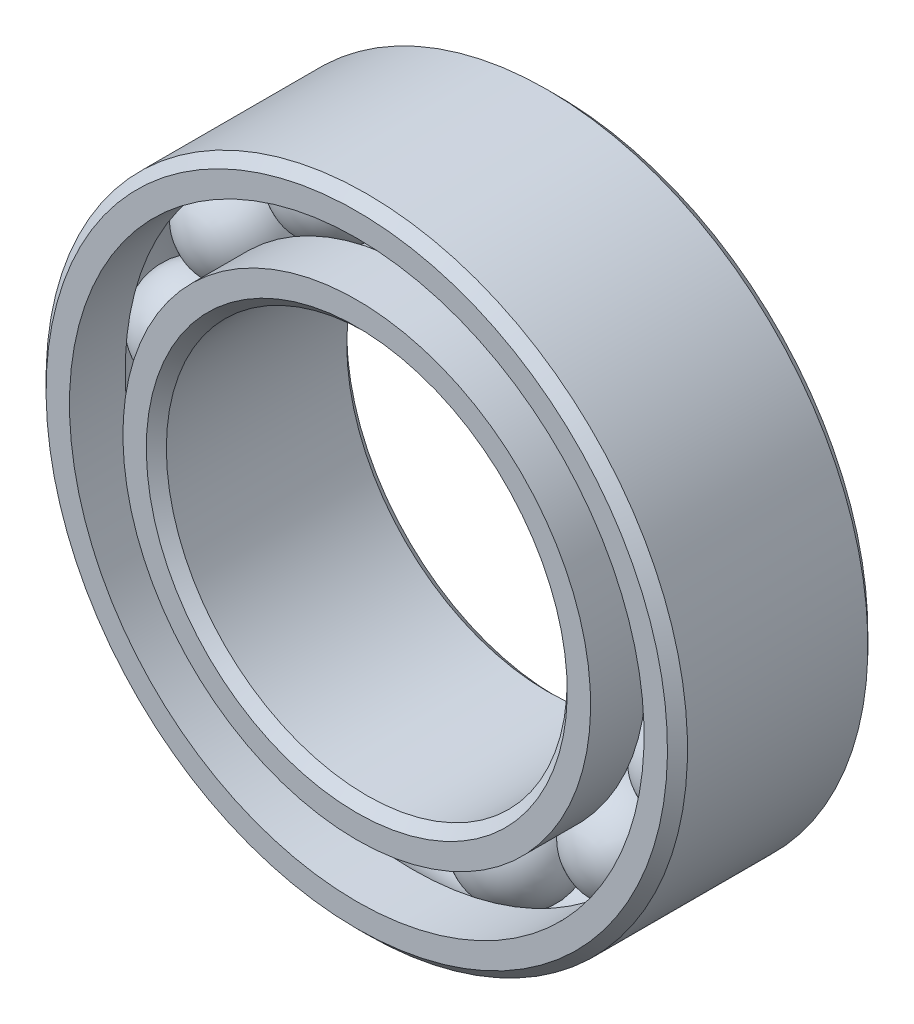
ISO-10303-21;
HEADER;
FILE_DESCRIPTION(('STEP AP214'),'2;1');
FILE_NAME('part.step','',(''),(''),'','','');
FILE_SCHEMA(('AUTOMOTIVE_DESIGN { 1 0 10303 214 1 1 1 1 }'));
ENDSEC;
DATA;
#1=APPLICATION_CONTEXT('core data for automotive mechanical design processes');
#2=APPLICATION_PROTOCOL_DEFINITION('international standard','automotive_design',2000,#1);
#3=PRODUCT_CONTEXT('',#1,'mechanical');
#4=PRODUCT('Part','Part','',(#3));
#5=PRODUCT_RELATED_PRODUCT_CATEGORY('part','',(#4));
#6=PRODUCT_DEFINITION_FORMATION('','',#4);
#7=PRODUCT_DEFINITION_CONTEXT('part definition',#1,'design');
#8=PRODUCT_DEFINITION('design','',#6,#7);
#9=PRODUCT_DEFINITION_SHAPE('','',#8);
#10=(LENGTH_UNIT() NAMED_UNIT(*) SI_UNIT(.MILLI.,.METRE.));
#11=(NAMED_UNIT(*) PLANE_ANGLE_UNIT() SI_UNIT($,.RADIAN.));
#12=(NAMED_UNIT(*) SI_UNIT($,.STERADIAN.) SOLID_ANGLE_UNIT());
#13=UNCERTAINTY_MEASURE_WITH_UNIT(LENGTH_MEASURE(1.E-05),#10,'distance_accuracy_value','');
#14=(GEOMETRIC_REPRESENTATION_CONTEXT(3) GLOBAL_UNCERTAINTY_ASSIGNED_CONTEXT((#13)) GLOBAL_UNIT_ASSIGNED_CONTEXT((#10,
#11,#12)) REPRESENTATION_CONTEXT('',''));
#15=CARTESIAN_POINT('',(0.,0.,0.));
#16=DIRECTION('',(0.,0.,1.));
#17=DIRECTION('',(1.,0.,0.));
#18=AXIS2_PLACEMENT_3D('',#15,#16,#17);
#19=CARTESIAN_POINT('',(6.04140123656884,11.5109283334918,0.));
#20=DIRECTION('',(0.,0.,1.));
#21=DIRECTION('',(0.464723172043757,0.885456025653216,0.));
#22=AXIS2_PLACEMENT_3D('',#19,#20,#21);
#23=SPHERICAL_SURFACE('',#22,2.5915341754868);
#24=CARTESIAN_POINT('',(6.04140123656884,11.5109283334918,2.5915341754868));
#25=VERTEX_POINT('',#24);
#26=VERTEX_LOOP('',#25);
#27=FACE_BOUND('',#26,.T.);
#28=ADVANCED_FACE('F46',(#27),#23,.T.);
#29=CLOSED_SHELL('',(#28));
#30=MANIFOLD_SOLID_BREP('B2',#29);
#31=CARTESIAN_POINT('',(10.6987902566174,7.38484170750515,0.));
#32=DIRECTION('',(0.,0.,1.));
#33=DIRECTION('',(0.822983865893649,0.568064746731166,0.));
#34=AXIS2_PLACEMENT_3D('',#31,#32,#33);
#35=SPHERICAL_SURFACE('',#34,2.5915341754868);
#36=CARTESIAN_POINT('',(10.6987902566174,7.38484170750515,2.5915341754868));
#37=VERTEX_POINT('',#36);
#38=VERTEX_LOOP('',#37);
#39=FACE_BOUND('',#38,.T.);
#40=ADVANCED_FACE('F65',(#39),#35,.T.);
#41=CLOSED_SHELL('',(#40));
#42=MANIFOLD_SOLID_BREP('B6',#41);
#43=CARTESIAN_POINT('',(12.9052153632747,1.56697684331934,0.));
#44=DIRECTION('',(0.,0.,1.));
#45=DIRECTION('',(0.992708874098053,0.120536680255334,0.));
#46=AXIS2_PLACEMENT_3D('',#43,#44,#45);
#47=SPHERICAL_SURFACE('',#46,2.5915341754868);
#48=CARTESIAN_POINT('',(12.9052153632747,1.56697684331934,2.5915341754868));
#49=VERTEX_POINT('',#48);
#50=VERTEX_LOOP('',#49);
#51=FACE_BOUND('',#50,.T.);
#52=ADVANCED_FACE('F84',(#51),#47,.T.);
#53=CLOSED_SHELL('',(#52));
#54=MANIFOLD_SOLID_BREP('B42',#53);
#55=CARTESIAN_POINT('',(12.1552111549104,-4.60986353155285,0.));
#56=DIRECTION('',(0.,0.,1.));
#57=DIRECTION('',(0.935016242685418,-0.354604887042527,0.));
#58=AXIS2_PLACEMENT_3D('',#55,#56,#57);
#59=SPHERICAL_SURFACE('',#58,2.5915341754868);
#60=CARTESIAN_POINT('',(12.1552111549104,-4.60986353155285,2.5915341754868));
#61=VERTEX_POINT('',#60);
#62=VERTEX_LOOP('',#61);
#63=FACE_BOUND('',#62,.T.);
#64=ADVANCED_FACE('F103',(#63),#59,.T.);
#65=CLOSED_SHELL('',(#64));
#66=MANIFOLD_SOLID_BREP('B61',#65);
#67=CARTESIAN_POINT('',(8.62059455713042,-9.73063972622424,0.));
#68=DIRECTION('',(0.,0.,1.));
#69=DIRECTION('',(0.663122658240802,-0.748510748171095,0.));
#70=AXIS2_PLACEMENT_3D('',#67,#68,#69);
#71=SPHERICAL_SURFACE('',#70,2.5915341754868);
#72=CARTESIAN_POINT('',(8.62059455713042,-9.73063972622424,2.59153417548679));
#73=VERTEX_POINT('',#72);
#74=VERTEX_LOOP('',#73);
#75=FACE_BOUND('',#74,.T.);
#76=ADVANCED_FACE('F122',(#75),#71,.T.);
#77=CLOSED_SHELL('',(#76));
#78=MANIFOLD_SOLID_BREP('B80',#77);
#79=CARTESIAN_POINT('',(3.11110363573835,-12.6222436265387,0.));
#80=DIRECTION('',(0.,0.,1.));
#81=DIRECTION('',(0.239315664287565,-0.97094181742605,0.));
#82=AXIS2_PLACEMENT_3D('',#79,#80,#81);
#83=SPHERICAL_SURFACE('',#82,2.5915341754868);
#84=CARTESIAN_POINT('',(3.11110363573835,-12.6222436265387,2.59153417548679));
#85=VERTEX_POINT('',#84);
#86=VERTEX_LOOP('',#85);
#87=FACE_BOUND('',#86,.T.);
#88=ADVANCED_FACE('F141',(#87),#83,.T.);
#89=CLOSED_SHELL('',(#88));
#90=MANIFOLD_SOLID_BREP('B99',#89);
#91=CARTESIAN_POINT('',(-3.11110363573817,-12.6222436265387,0.));
#92=DIRECTION('',(0.,0.,1.));
#93=DIRECTION('',(-0.239315664287552,-0.970941817426054,0.));
#94=AXIS2_PLACEMENT_3D('',#91,#92,#93);
#95=SPHERICAL_SURFACE('',#94,2.5915341754868);
#96=CARTESIAN_POINT('',(-3.11110363573817,-12.6222436265387,2.59153417548679));
#97=VERTEX_POINT('',#96);
#98=VERTEX_LOOP('',#97);
#99=FACE_BOUND('',#98,.T.);
#100=ADVANCED_FACE('F160',(#99),#95,.T.);
#101=CLOSED_SHELL('',(#100));
#102=MANIFOLD_SOLID_BREP('B118',#101);
#103=CARTESIAN_POINT('',(-8.62059455713028,-9.73063972622436,0.));
#104=DIRECTION('',(0.,0.,1.));
#105=DIRECTION('',(-0.663122658240791,-0.748510748171105,0.));
#106=AXIS2_PLACEMENT_3D('',#103,#104,#105);
#107=SPHERICAL_SURFACE('',#106,2.5915341754868);
#108=CARTESIAN_POINT('',(-8.62059455713028,-9.73063972622436,2.59153417548679));
#109=VERTEX_POINT('',#108);
#110=VERTEX_LOOP('',#109);
#111=FACE_BOUND('',#110,.T.);
#112=ADVANCED_FACE('F179',(#111),#107,.T.);
#113=CLOSED_SHELL('',(#112));
#114=MANIFOLD_SOLID_BREP('B137',#113);
#115=CARTESIAN_POINT('',(-12.1552111549104,-4.60986353155301,0.));
#116=DIRECTION('',(0.,0.,1.));
#117=DIRECTION('',(-0.935016242685413,-0.35460488704254,0.));
#118=AXIS2_PLACEMENT_3D('',#115,#116,#117);
#119=SPHERICAL_SURFACE('',#118,2.5915341754868);
#120=CARTESIAN_POINT('',(-12.1552111549104,-4.60986353155301,2.5915341754868));
#121=VERTEX_POINT('',#120);
#122=VERTEX_LOOP('',#121);
#123=FACE_BOUND('',#122,.T.);
#124=ADVANCED_FACE('F198',(#123),#119,.T.);
#125=CLOSED_SHELL('',(#124));
#126=MANIFOLD_SOLID_BREP('B156',#125);
#127=CARTESIAN_POINT('',(-12.9052153632747,1.56697684331916,0.));
#128=DIRECTION('',(0.,0.,1.));
#129=DIRECTION('',(-0.992708874098054,0.12053668025532,0.));
#130=AXIS2_PLACEMENT_3D('',#127,#128,#129);
#131=SPHERICAL_SURFACE('',#130,2.5915341754868);
#132=CARTESIAN_POINT('',(-12.9052153632747,1.56697684331916,2.5915341754868));
#133=VERTEX_POINT('',#132);
#134=VERTEX_LOOP('',#133);
#135=FACE_BOUND('',#134,.T.);
#136=ADVANCED_FACE('F217',(#135),#131,.T.);
#137=CLOSED_SHELL('',(#136));
#138=MANIFOLD_SOLID_BREP('B175',#137);
#139=CARTESIAN_POINT('',(-10.6987902566175,7.384841707505,0.));
#140=DIRECTION('',(0.,0.,1.));
#141=DIRECTION('',(-0.822983865893658,0.568064746731154,0.));
#142=AXIS2_PLACEMENT_3D('',#139,#140,#141);
#143=SPHERICAL_SURFACE('',#142,2.5915341754868);
#144=CARTESIAN_POINT('',(-10.6987902566175,7.384841707505,2.5915341754868));
#145=VERTEX_POINT('',#144);
#146=VERTEX_LOOP('',#145);
#147=FACE_BOUND('',#146,.T.);
#148=ADVANCED_FACE('F236',(#147),#143,.T.);
#149=CLOSED_SHELL('',(#148));
#150=MANIFOLD_SOLID_BREP('B194',#149);
#151=CARTESIAN_POINT('',(-6.041401236569,11.5109283334917,0.));
#152=DIRECTION('',(0.,0.,1.));
#153=DIRECTION('',(-0.46472317204377,0.885456025653209,0.));
#154=AXIS2_PLACEMENT_3D('',#151,#152,#153);
#155=SPHERICAL_SURFACE('',#154,2.5915341754868);
#156=CARTESIAN_POINT('',(-6.041401236569,11.5109283334917,2.5915341754868));
#157=VERTEX_POINT('',#156);
#158=VERTEX_LOOP('',#157);
#159=FACE_BOUND('',#158,.T.);
#160=ADVANCED_FACE('F255',(#159),#155,.T.);
#161=CLOSED_SHELL('',(#160));
#162=MANIFOLD_SOLID_BREP('B213',#161);
#163=CARTESIAN_POINT('',(0.,13.,0.));
#164=DIRECTION('',(0.,0.,1.));
#165=DIRECTION('',(0.,1.,0.));
#166=AXIS2_PLACEMENT_3D('',#163,#164,#165);
#167=SPHERICAL_SURFACE('',#166,2.5915341754868);
#168=CARTESIAN_POINT('',(0.,13.,2.5915341754868));
#169=VERTEX_POINT('',#168);
#170=VERTEX_LOOP('',#169);
#171=FACE_BOUND('',#170,.T.);
#172=ADVANCED_FACE('F276',(#171),#167,.T.);
#173=CLOSED_SHELL('',(#172));
#174=MANIFOLD_SOLID_BREP('B232',#173);
#175=CARTESIAN_POINT('',(0.,11.6666666666667,5.));
#176=DIRECTION('',(0.,0.,-1.));
#177=DIRECTION('',(0.,1.,0.));
#178=AXIS2_PLACEMENT_3D('',#175,#176,#177);
#179=PLANE('',#178);
#180=CARTESIAN_POINT('',(0.,0.,5.));
#181=DIRECTION('',(0.,0.,1.));
#182=DIRECTION('',(0.,-1.,0.));
#183=AXIS2_PLACEMENT_3D('',#180,#181,#182);
#184=CIRCLE('',#183,10.5);
#185=CARTESIAN_POINT('',(0.,-10.5,5.));
#186=VERTEX_POINT('',#185);
#187=EDGE_CURVE('E333',#186,#186,#184,.T.);
#188=ORIENTED_EDGE('',*,*,#187,.F.);
#189=EDGE_LOOP('',(#188));
#190=FACE_BOUND('',#189,.T.);
#191=CARTESIAN_POINT('',(0.,0.,5.));
#192=DIRECTION('',(0.,0.,1.));
#193=DIRECTION('',(0.,-1.,0.));
#194=AXIS2_PLACEMENT_3D('',#191,#192,#193);
#195=CIRCLE('',#194,11.6666666666667);
#196=CARTESIAN_POINT('',(0.,-11.6666666666667,5.));
#197=VERTEX_POINT('',#196);
#198=EDGE_CURVE('E275',#197,#197,#195,.T.);
#199=ORIENTED_EDGE('',*,*,#198,.T.);
#200=EDGE_LOOP('',(#199));
#201=FACE_BOUND('',#200,.T.);
#202=ADVANCED_FACE('F296',(#190,#201),#179,.F.);
#203=CARTESIAN_POINT('',(0.,0.,4.99999999999999));
#204=DIRECTION('',(0.,0.,1.));
#205=DIRECTION('',(0.,-1.,0.));
#206=AXIS2_PLACEMENT_3D('',#203,#204,#205);
#207=CYLINDRICAL_SURFACE('',#206,11.6666666666667);
#208=ORIENTED_EDGE('',*,*,#198,.F.);
#209=EDGE_LOOP('',(#208));
#210=FACE_BOUND('',#209,.T.);
#211=CARTESIAN_POINT('',(0.,0.,2.22222222222222));
#212=DIRECTION('',(0.,0.,1.));
#213=DIRECTION('',(0.,-1.,0.));
#214=AXIS2_PLACEMENT_3D('',#211,#212,#213);
#215=CIRCLE('',#214,11.6666666666667);
#216=CARTESIAN_POINT('',(0.,-11.6666666666667,2.22222222222221));
#217=VERTEX_POINT('',#216);
#218=EDGE_CURVE('E303',#217,#217,#215,.T.);
#219=ORIENTED_EDGE('',*,*,#218,.T.);
#220=EDGE_LOOP('',(#219));
#221=FACE_BOUND('',#220,.T.);
#222=ADVANCED_FACE('F342',(#210,#221),#207,.T.);
#223=CARTESIAN_POINT('',(0.,0.,0.));
#224=DIRECTION('',(0.,0.,1.));
#225=DIRECTION('',(0.,-1.,0.));
#226=AXIS2_PLACEMENT_3D('',#223,#224,#225);
#227=TOROIDAL_SURFACE('',#226,13.,2.59153417548681);
#228=ORIENTED_EDGE('',*,*,#218,.F.);
#229=EDGE_LOOP('',(#228));
#230=FACE_BOUND('',#229,.T.);
#231=CARTESIAN_POINT('',(0.,0.,-2.22222222222222));
#232=DIRECTION('',(0.,0.,1.));
#233=DIRECTION('',(0.,-1.,0.));
#234=AXIS2_PLACEMENT_3D('',#231,#232,#233);
#235=CIRCLE('',#234,11.6666666666667);
#236=CARTESIAN_POINT('',(0.,-11.6666666666667,-2.22222222222222));
#237=VERTEX_POINT('',#236);
#238=EDGE_CURVE('E309',#237,#237,#235,.T.);
#239=ORIENTED_EDGE('',*,*,#238,.T.);
#240=EDGE_LOOP('',(#239));
#241=FACE_BOUND('',#240,.T.);
#242=ADVANCED_FACE('F346',(#230,#241),#227,.F.);
#243=CARTESIAN_POINT('',(0.,0.,4.99999999999999));
#244=DIRECTION('',(0.,0.,1.));
#245=DIRECTION('',(0.,-1.,0.));
#246=AXIS2_PLACEMENT_3D('',#243,#244,#245);
#247=CYLINDRICAL_SURFACE('',#246,11.6666666666667);
#248=ORIENTED_EDGE('',*,*,#238,.F.);
#249=EDGE_LOOP('',(#248));
#250=FACE_BOUND('',#249,.T.);
#251=CARTESIAN_POINT('',(0.,0.,-5.));
#252=DIRECTION('',(0.,0.,1.));
#253=DIRECTION('',(0.,-1.,0.));
#254=AXIS2_PLACEMENT_3D('',#251,#252,#253);
#255=CIRCLE('',#254,11.6666666666667);
#256=CARTESIAN_POINT('',(0.,-11.6666666666667,-5.));
#257=VERTEX_POINT('',#256);
#258=EDGE_CURVE('E315',#257,#257,#255,.T.);
#259=ORIENTED_EDGE('',*,*,#258,.T.);
#260=EDGE_LOOP('',(#259));
#261=FACE_BOUND('',#260,.T.);
#262=ADVANCED_FACE('F351',(#250,#261),#247,.T.);
#263=CARTESIAN_POINT('',(0.,10.5,-5.));
#264=DIRECTION('',(0.,0.,1.));
#265=DIRECTION('',(0.,-1.,0.));
#266=AXIS2_PLACEMENT_3D('',#263,#264,#265);
#267=PLANE('',#266);
#268=ORIENTED_EDGE('',*,*,#258,.F.);
#269=EDGE_LOOP('',(#268));
#270=FACE_BOUND('',#269,.T.);
#271=CARTESIAN_POINT('',(0.,0.,-5.00000000000001));
#272=DIRECTION('',(0.,0.,1.));
#273=DIRECTION('',(0.,-1.,0.));
#274=AXIS2_PLACEMENT_3D('',#271,#272,#273);
#275=CIRCLE('',#274,10.5);
#276=CARTESIAN_POINT('',(0.,-10.5,-5.00000000000001));
#277=VERTEX_POINT('',#276);
#278=EDGE_CURVE('E321',#277,#277,#275,.T.);
#279=ORIENTED_EDGE('',*,*,#278,.T.);
#280=EDGE_LOOP('',(#279));
#281=FACE_BOUND('',#280,.T.);
#282=ADVANCED_FACE('F357',(#270,#281),#267,.F.);
#283=CARTESIAN_POINT('',(0.,0.,-4.50000000000001));
#284=DIRECTION('',(0.,0.,-1.));
#285=DIRECTION('',(0.,1.,0.));
#286=AXIS2_PLACEMENT_3D('',#283,#284,#285);
#287=CONICAL_SURFACE('',#286,10.,0.785398163397438);
#288=ORIENTED_EDGE('',*,*,#278,.F.);
#289=EDGE_LOOP('',(#288));
#290=FACE_BOUND('',#289,.T.);
#291=CARTESIAN_POINT('',(0.,0.,-4.50000000000001));
#292=DIRECTION('',(0.,0.,1.));
#293=DIRECTION('',(0.,-1.,0.));
#294=AXIS2_PLACEMENT_3D('',#291,#292,#293);
#295=CIRCLE('',#294,10.);
#296=CARTESIAN_POINT('',(0.,-10.,-4.50000000000001));
#297=VERTEX_POINT('',#296);
#298=EDGE_CURVE('E325',#297,#297,#295,.T.);
#299=ORIENTED_EDGE('',*,*,#298,.T.);
#300=EDGE_LOOP('',(#299));
#301=FACE_BOUND('',#300,.T.);
#302=ADVANCED_FACE('F361',(#290,#301),#287,.F.);
#303=CARTESIAN_POINT('',(0.,0.,4.99999999999999));
#304=DIRECTION('',(0.,0.,1.));
#305=DIRECTION('',(0.,-1.,0.));
#306=AXIS2_PLACEMENT_3D('',#303,#304,#305);
#307=CYLINDRICAL_SURFACE('',#306,10.);
#308=ORIENTED_EDGE('',*,*,#298,.F.);
#309=EDGE_LOOP('',(#308));
#310=FACE_BOUND('',#309,.T.);
#311=CARTESIAN_POINT('',(0.,0.,4.50000000000002));
#312=DIRECTION('',(0.,0.,1.));
#313=DIRECTION('',(0.,-1.,0.));
#314=AXIS2_PLACEMENT_3D('',#311,#312,#313);
#315=CIRCLE('',#314,10.);
#316=CARTESIAN_POINT('',(0.,-10.,4.50000000000001));
#317=VERTEX_POINT('',#316);
#318=EDGE_CURVE('E329',#317,#317,#315,.T.);
#319=ORIENTED_EDGE('',*,*,#318,.T.);
#320=EDGE_LOOP('',(#319));
#321=FACE_BOUND('',#320,.T.);
#322=ADVANCED_FACE('F365',(#310,#321),#307,.F.);
#323=CARTESIAN_POINT('',(0.,0.,5.));
#324=DIRECTION('',(0.,0.,1.));
#325=DIRECTION('',(0.,-1.,0.));
#326=AXIS2_PLACEMENT_3D('',#323,#324,#325);
#327=CONICAL_SURFACE('',#326,10.5,0.785398163397457);
#328=ORIENTED_EDGE('',*,*,#318,.F.);
#329=EDGE_LOOP('',(#328));
#330=FACE_BOUND('',#329,.T.);
#331=ORIENTED_EDGE('',*,*,#187,.T.);
#332=EDGE_LOOP('',(#331));
#333=FACE_BOUND('',#332,.T.);
#334=ADVANCED_FACE('F339',(#330,#333),#327,.F.);
#335=CLOSED_SHELL('',(#202,#222,#242,#262,#282,#302,#322,#334));
#336=MANIFOLD_SOLID_BREP('B251',#335);
#337=CARTESIAN_POINT('',(0.,0.,4.99999999999999));
#338=DIRECTION('',(0.,0.,1.));
#339=DIRECTION('',(0.,-1.,0.));
#340=AXIS2_PLACEMENT_3D('',#337,#338,#339);
#341=CYLINDRICAL_SURFACE('',#340,16.);
#342=CARTESIAN_POINT('',(0.,0.,4.5));
#343=DIRECTION('',(0.,0.,1.));
#344=DIRECTION('',(0.,-1.,0.));
#345=AXIS2_PLACEMENT_3D('',#342,#343,#344);
#346=CIRCLE('',#345,16.);
#347=CARTESIAN_POINT('',(0.,-16.,4.5));
#348=VERTEX_POINT('',#347);
#349=EDGE_CURVE('E295',#348,#348,#346,.T.);
#350=ORIENTED_EDGE('',*,*,#349,.F.);
#351=EDGE_LOOP('',(#350));
#352=FACE_BOUND('',#351,.T.);
#353=CARTESIAN_POINT('',(0.,0.,-4.50000000000001));
#354=DIRECTION('',(0.,0.,1.));
#355=DIRECTION('',(0.,-1.,0.));
#356=AXIS2_PLACEMENT_3D('',#353,#354,#355);
#357=CIRCLE('',#356,16.);
#358=CARTESIAN_POINT('',(0.,-16.,-4.50000000000001));
#359=VERTEX_POINT('',#358);
#360=EDGE_CURVE('E471',#359,#359,#357,.T.);
#361=ORIENTED_EDGE('',*,*,#360,.T.);
#362=EDGE_LOOP('',(#361));
#363=FACE_BOUND('',#362,.T.);
#364=ADVANCED_FACE('F434',(#352,#363),#341,.T.);
#365=CARTESIAN_POINT('',(0.,0.,4.5));
#366=DIRECTION('',(0.,0.,-1.));
#367=DIRECTION('',(0.,1.,0.));
#368=AXIS2_PLACEMENT_3D('',#365,#366,#367);
#369=CONICAL_SURFACE('',#368,16.,0.785398163397441);
#370=CARTESIAN_POINT('',(0.,0.,4.99999999999999));
#371=DIRECTION('',(0.,0.,1.));
#372=DIRECTION('',(0.,-1.,0.));
#373=AXIS2_PLACEMENT_3D('',#370,#371,#372);
#374=CIRCLE('',#373,15.5);
#375=CARTESIAN_POINT('',(0.,-15.5,4.99999999999999));
#376=VERTEX_POINT('',#375);
#377=EDGE_CURVE('E441',#376,#376,#374,.T.);
#378=ORIENTED_EDGE('',*,*,#377,.F.);
#379=EDGE_LOOP('',(#378));
#380=FACE_BOUND('',#379,.T.);
#381=ORIENTED_EDGE('',*,*,#349,.T.);
#382=EDGE_LOOP('',(#381));
#383=FACE_BOUND('',#382,.T.);
#384=ADVANCED_FACE('F510',(#380,#383),#369,.T.);
#385=CARTESIAN_POINT('',(0.,15.5,4.99999999999999));
#386=DIRECTION('',(0.,0.,-1.));
#387=DIRECTION('',(0.,1.,0.));
#388=AXIS2_PLACEMENT_3D('',#385,#386,#387);
#389=PLANE('',#388);
#390=CARTESIAN_POINT('',(0.,0.,4.99999999999999));
#391=DIRECTION('',(0.,0.,1.));
#392=DIRECTION('',(0.,-1.,0.));
#393=AXIS2_PLACEMENT_3D('',#390,#391,#392);
#394=CIRCLE('',#393,14.3333333333333);
#395=CARTESIAN_POINT('',(0.,-14.3333333333333,4.99999999999999));
#396=VERTEX_POINT('',#395);
#397=EDGE_CURVE('E447',#396,#396,#394,.T.);
#398=ORIENTED_EDGE('',*,*,#397,.F.);
#399=EDGE_LOOP('',(#398));
#400=FACE_BOUND('',#399,.T.);
#401=ORIENTED_EDGE('',*,*,#377,.T.);
#402=EDGE_LOOP('',(#401));
#403=FACE_BOUND('',#402,.T.);
#404=ADVANCED_FACE('F505',(#400,#403),#389,.F.);
#405=CARTESIAN_POINT('',(0.,0.,4.99999999999999));
#406=DIRECTION('',(0.,0.,1.));
#407=DIRECTION('',(0.,-1.,0.));
#408=AXIS2_PLACEMENT_3D('',#405,#406,#407);
#409=CYLINDRICAL_SURFACE('',#408,14.3333333333333);
#410=CARTESIAN_POINT('',(0.,0.,2.22222222222221));
#411=DIRECTION('',(0.,0.,1.));
#412=DIRECTION('',(0.,-1.,0.));
#413=AXIS2_PLACEMENT_3D('',#410,#411,#412);
#414=CIRCLE('',#413,14.3333333333333);
#415=CARTESIAN_POINT('',(0.,-14.3333333333333,2.22222222222221));
#416=VERTEX_POINT('',#415);
#417=EDGE_CURVE('E453',#416,#416,#414,.T.);
#418=ORIENTED_EDGE('',*,*,#417,.F.);
#419=EDGE_LOOP('',(#418));
#420=FACE_BOUND('',#419,.T.);
#421=ORIENTED_EDGE('',*,*,#397,.T.);
#422=EDGE_LOOP('',(#421));
#423=FACE_BOUND('',#422,.T.);
#424=ADVANCED_FACE('F499',(#420,#423),#409,.F.);
#425=CARTESIAN_POINT('',(0.,0.,0.));
#426=DIRECTION('',(0.,0.,1.));
#427=DIRECTION('',(0.,-1.,0.));
#428=AXIS2_PLACEMENT_3D('',#425,#426,#427);
#429=TOROIDAL_SURFACE('',#428,13.,2.5915341754868);
#430=CARTESIAN_POINT('',(0.,0.,-2.22222222222223));
#431=DIRECTION('',(0.,0.,1.));
#432=DIRECTION('',(0.,-1.,0.));
#433=AXIS2_PLACEMENT_3D('',#430,#431,#432);
#434=CIRCLE('',#433,14.3333333333333);
#435=CARTESIAN_POINT('',(0.,-14.3333333333333,-2.22222222222223));
#436=VERTEX_POINT('',#435);
#437=EDGE_CURVE('E459',#436,#436,#434,.T.);
#438=ORIENTED_EDGE('',*,*,#437,.F.);
#439=EDGE_LOOP('',(#438));
#440=FACE_BOUND('',#439,.T.);
#441=ORIENTED_EDGE('',*,*,#417,.T.);
#442=EDGE_LOOP('',(#441));
#443=FACE_BOUND('',#442,.T.);
#444=ADVANCED_FACE('F493',(#440,#443),#429,.F.);
#445=CARTESIAN_POINT('',(0.,0.,4.99999999999999));
#446=DIRECTION('',(0.,0.,1.));
#447=DIRECTION('',(0.,-1.,0.));
#448=AXIS2_PLACEMENT_3D('',#445,#446,#447);
#449=CYLINDRICAL_SURFACE('',#448,14.3333333333333);
#450=CARTESIAN_POINT('',(0.,0.,-5.00000000000001));
#451=DIRECTION('',(0.,0.,1.));
#452=DIRECTION('',(0.,-1.,0.));
#453=AXIS2_PLACEMENT_3D('',#450,#451,#452);
#454=CIRCLE('',#453,14.3333333333333);
#455=CARTESIAN_POINT('',(0.,-14.3333333333333,-5.00000000000001));
#456=VERTEX_POINT('',#455);
#457=EDGE_CURVE('E463',#456,#456,#454,.T.);
#458=ORIENTED_EDGE('',*,*,#457,.F.);
#459=EDGE_LOOP('',(#458));
#460=FACE_BOUND('',#459,.T.);
#461=ORIENTED_EDGE('',*,*,#437,.T.);
#462=EDGE_LOOP('',(#461));
#463=FACE_BOUND('',#462,.T.);
#464=ADVANCED_FACE('F487',(#460,#463),#449,.F.);
#465=CARTESIAN_POINT('',(0.,15.5,-5.));
#466=DIRECTION('',(0.,0.,1.));
#467=DIRECTION('',(0.,-1.,0.));
#468=AXIS2_PLACEMENT_3D('',#465,#466,#467);
#469=PLANE('',#468);
#470=CARTESIAN_POINT('',(0.,0.,-5.00000000000001));
#471=DIRECTION('',(0.,0.,1.));
#472=DIRECTION('',(0.,-1.,0.));
#473=AXIS2_PLACEMENT_3D('',#470,#471,#472);
#474=CIRCLE('',#473,15.5);
#475=CARTESIAN_POINT('',(0.,-15.5,-5.00000000000001));
#476=VERTEX_POINT('',#475);
#477=EDGE_CURVE('E467',#476,#476,#474,.T.);
#478=ORIENTED_EDGE('',*,*,#477,.F.);
#479=EDGE_LOOP('',(#478));
#480=FACE_BOUND('',#479,.T.);
#481=ORIENTED_EDGE('',*,*,#457,.T.);
#482=EDGE_LOOP('',(#481));
#483=FACE_BOUND('',#482,.T.);
#484=ADVANCED_FACE('F481',(#480,#483),#469,.F.);
#485=CARTESIAN_POINT('',(0.,0.,-5.00000000000001));
#486=DIRECTION('',(0.,0.,1.));
#487=DIRECTION('',(0.,-1.,0.));
#488=AXIS2_PLACEMENT_3D('',#485,#486,#487);
#489=CONICAL_SURFACE('',#488,15.5,0.785398163397443);
#490=ORIENTED_EDGE('',*,*,#360,.F.);
#491=EDGE_LOOP('',(#490));
#492=FACE_BOUND('',#491,.T.);
#493=ORIENTED_EDGE('',*,*,#477,.T.);
#494=EDGE_LOOP('',(#493));
#495=FACE_BOUND('',#494,.T.);
#496=ADVANCED_FACE('F478',(#492,#495),#489,.T.);
#497=CLOSED_SHELL('',(#364,#384,#404,#424,#444,#464,#484,#496));
#498=MANIFOLD_SOLID_BREP('B270',#497);
#499=ADVANCED_BREP_SHAPE_REPRESENTATION('',(#18,#30,#42,#54,#66,#78,#90,#102,#114,#126,#138,
#150,#162,#174,#336,#498),#14);
#500=SHAPE_DEFINITION_REPRESENTATION(#9,#499);
ENDSEC;
END-ISO-10303-21;
